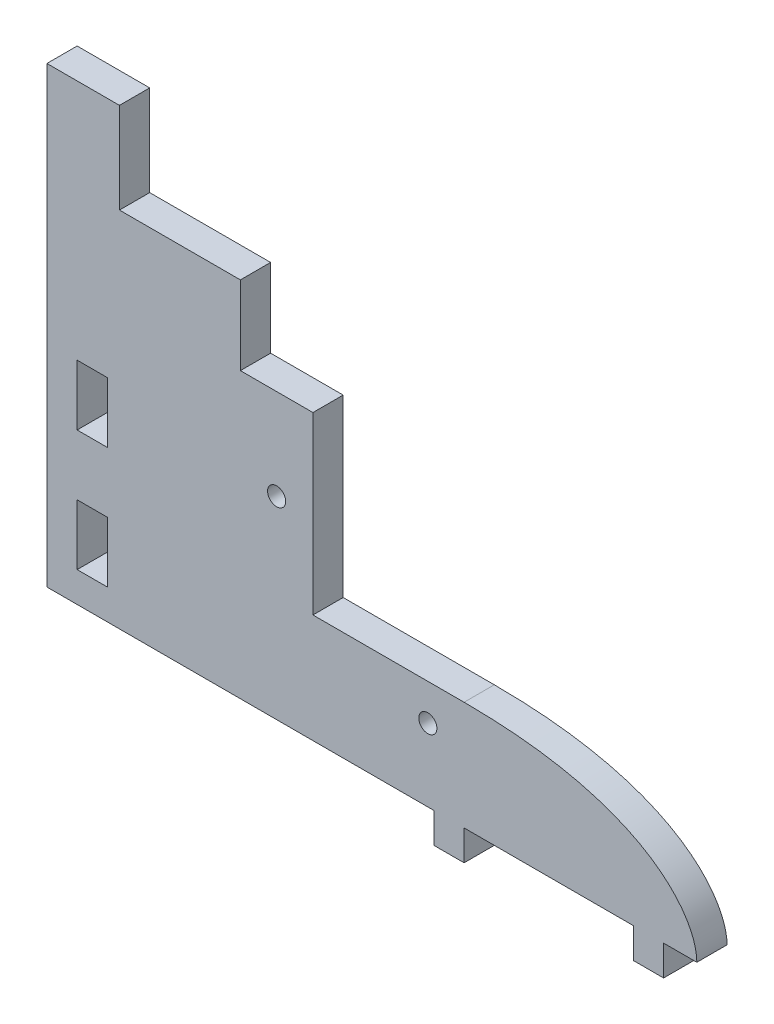
ISO-10303-21;
HEADER;
FILE_DESCRIPTION(('STEP AP214'),'2;1');
FILE_NAME('part.step','',(''),(''),'','','');
FILE_SCHEMA(('AUTOMOTIVE_DESIGN { 1 0 10303 214 1 1 1 1 }'));
ENDSEC;
DATA;
#1=APPLICATION_CONTEXT('core data for automotive mechanical design processes');
#2=APPLICATION_PROTOCOL_DEFINITION('international standard','automotive_design',2000,#1);
#3=PRODUCT_CONTEXT('',#1,'mechanical');
#4=PRODUCT('Part','Part','',(#3));
#5=PRODUCT_RELATED_PRODUCT_CATEGORY('part','',(#4));
#6=PRODUCT_DEFINITION_FORMATION('','',#4);
#7=PRODUCT_DEFINITION_CONTEXT('part definition',#1,'design');
#8=PRODUCT_DEFINITION('design','',#6,#7);
#9=PRODUCT_DEFINITION_SHAPE('','',#8);
#10=(LENGTH_UNIT() NAMED_UNIT(*) SI_UNIT(.MILLI.,.METRE.));
#11=(NAMED_UNIT(*) PLANE_ANGLE_UNIT() SI_UNIT($,.RADIAN.));
#12=(NAMED_UNIT(*) SI_UNIT($,.STERADIAN.) SOLID_ANGLE_UNIT());
#13=UNCERTAINTY_MEASURE_WITH_UNIT(LENGTH_MEASURE(1.E-05),#10,'distance_accuracy_value','');
#14=(GEOMETRIC_REPRESENTATION_CONTEXT(3) GLOBAL_UNCERTAINTY_ASSIGNED_CONTEXT((#13)) GLOBAL_UNIT_ASSIGNED_CONTEXT((#10,
#11,#12)) REPRESENTATION_CONTEXT('',''));
#15=CARTESIAN_POINT('',(0.,0.,0.));
#16=DIRECTION('',(0.,0.,1.));
#17=DIRECTION('',(1.,0.,0.));
#18=AXIS2_PLACEMENT_3D('',#15,#16,#17);
#19=CARTESIAN_POINT('',(37.,0.,5.));
#20=DIRECTION('',(-1.,0.,0.));
#21=DIRECTION('',(0.,0.,1.));
#22=AXIS2_PLACEMENT_3D('',#19,#20,#21);
#23=PLANE('',#22);
#24=DIRECTION('',(0.,0.,-1.));
#25=VECTOR('',#24,1.);
#26=CARTESIAN_POINT('',(37.,0.,5.));
#27=LINE('',#26,#25);
#28=CARTESIAN_POINT('',(37.,0.,5.));
#29=VERTEX_POINT('',#28);
#30=CARTESIAN_POINT('',(37.,0.,0.));
#31=VERTEX_POINT('',#30);
#32=EDGE_CURVE('E176',#29,#31,#27,.T.);
#33=ORIENTED_EDGE('',*,*,#32,.F.);
#34=DIRECTION('',(0.,1.,0.));
#35=VECTOR('',#34,1.);
#36=CARTESIAN_POINT('',(37.,0.,5.));
#37=LINE('',#36,#35);
#38=CARTESIAN_POINT('',(37.,-5.,5.));
#39=VERTEX_POINT('',#38);
#40=EDGE_CURVE('E114',#39,#29,#37,.T.);
#41=ORIENTED_EDGE('',*,*,#40,.F.);
#42=DIRECTION('',(0.,0.,-1.));
#43=VECTOR('',#42,1.);
#44=CARTESIAN_POINT('',(37.,-5.,5.));
#45=LINE('',#44,#43);
#46=CARTESIAN_POINT('',(37.,-5.,0.));
#47=VERTEX_POINT('',#46);
#48=EDGE_CURVE('E174',#39,#47,#45,.T.);
#49=ORIENTED_EDGE('',*,*,#48,.T.);
#50=DIRECTION('',(0.,1.,0.));
#51=VECTOR('',#50,1.);
#52=CARTESIAN_POINT('',(37.,0.,0.));
#53=LINE('',#52,#51);
#54=EDGE_CURVE('E134',#47,#31,#53,.T.);
#55=ORIENTED_EDGE('',*,*,#54,.T.);
#56=EDGE_LOOP('',(#33,#41,#49,#55));
#57=FACE_BOUND('',#56,.T.);
#58=ADVANCED_FACE('F35',(#57),#23,.F.);
#59=CARTESIAN_POINT('',(0.,0.,5.));
#60=DIRECTION('',(0.,0.,-1.));
#61=DIRECTION('',(-1.,0.,0.));
#62=AXIS2_PLACEMENT_3D('',#59,#60,#61);
#63=PLANE('',#62);
#64=CARTESIAN_POINT('',(6.,32.,5.));
#65=DIRECTION('',(0.,0.,1.));
#66=DIRECTION('',(1.,0.,0.));
#67=AXIS2_PLACEMENT_3D('',#64,#65,#66);
#68=CIRCLE('',#67,1.5);
#69=CARTESIAN_POINT('',(7.5,32.,5.));
#70=VERTEX_POINT('',#69);
#71=EDGE_CURVE('E129',#70,#70,#68,.T.);
#72=ORIENTED_EDGE('',*,*,#71,.F.);
#73=EDGE_LOOP('',(#72));
#74=FACE_BOUND('',#73,.T.);
#75=DIRECTION('',(-1.,0.,0.));
#76=VECTOR('',#75,1.);
#77=CARTESIAN_POINT('',(0.,47.,5.));
#78=LINE('',#77,#76);
#79=CARTESIAN_POINT('',(12.,47.,5.));
#80=VERTEX_POINT('',#79);
#81=CARTESIAN_POINT('',(0.,47.,5.));
#82=VERTEX_POINT('',#81);
#83=EDGE_CURVE('E54',#80,#82,#78,.T.);
#84=ORIENTED_EDGE('',*,*,#83,.T.);
#85=DIRECTION('',(0.,1.,0.));
#86=VECTOR('',#85,1.);
#87=CARTESIAN_POINT('',(0.,0.,5.));
#88=LINE('',#87,#86);
#89=CARTESIAN_POINT('',(0.,60.,5.));
#90=VERTEX_POINT('',#89);
#91=EDGE_CURVE('E239',#82,#90,#88,.T.);
#92=ORIENTED_EDGE('',*,*,#91,.T.);
#93=DIRECTION('',(-1.,0.,0.));
#94=VECTOR('',#93,1.);
#95=CARTESIAN_POINT('',(0.,60.,5.));
#96=LINE('',#95,#94);
#97=CARTESIAN_POINT('',(-20.,60.,5.));
#98=VERTEX_POINT('',#97);
#99=EDGE_CURVE('E236',#90,#98,#96,.T.);
#100=ORIENTED_EDGE('',*,*,#99,.T.);
#101=DIRECTION('',(0.,1.,0.));
#102=VECTOR('',#101,1.);
#103=CARTESIAN_POINT('',(-20.,0.,5.));
#104=LINE('',#103,#102);
#105=CARTESIAN_POINT('',(-20.,75.,5.));
#106=VERTEX_POINT('',#105);
#107=EDGE_CURVE('E233',#98,#106,#104,.T.);
#108=ORIENTED_EDGE('',*,*,#107,.T.);
#109=DIRECTION('',(-1.,0.,0.));
#110=VECTOR('',#109,1.);
#111=CARTESIAN_POINT('',(0.,75.,5.));
#112=LINE('',#111,#110);
#113=CARTESIAN_POINT('',(-32.,75.,5.));
#114=VERTEX_POINT('',#113);
#115=EDGE_CURVE('E230',#106,#114,#112,.T.);
#116=ORIENTED_EDGE('',*,*,#115,.T.);
#117=DIRECTION('',(0.,1.,0.));
#118=VECTOR('',#117,1.);
#119=CARTESIAN_POINT('',(-32.,0.,5.));
#120=LINE('',#119,#118);
#121=CARTESIAN_POINT('',(-32.,0.,5.));
#122=VERTEX_POINT('',#121);
#123=EDGE_CURVE('E242',#122,#114,#120,.T.);
#124=ORIENTED_EDGE('',*,*,#123,.F.);
#125=DIRECTION('',(1.,0.,0.));
#126=VECTOR('',#125,1.);
#127=CARTESIAN_POINT('',(0.,0.,5.));
#128=LINE('',#127,#126);
#129=CARTESIAN_POINT('',(32.,0.,5.));
#130=VERTEX_POINT('',#129);
#131=EDGE_CURVE('E93',#122,#130,#128,.T.);
#132=ORIENTED_EDGE('',*,*,#131,.T.);
#133=DIRECTION('',(0.,-1.,0.));
#134=VECTOR('',#133,1.);
#135=CARTESIAN_POINT('',(32.,0.,5.));
#136=LINE('',#135,#134);
#137=CARTESIAN_POINT('',(32.,-5.,5.));
#138=VERTEX_POINT('',#137);
#139=EDGE_CURVE('E151',#130,#138,#136,.T.);
#140=ORIENTED_EDGE('',*,*,#139,.T.);
#141=DIRECTION('',(1.,0.,0.));
#142=VECTOR('',#141,1.);
#143=CARTESIAN_POINT('',(37.,-5.,5.));
#144=LINE('',#143,#142);
#145=EDGE_CURVE('E153',#138,#39,#144,.T.);
#146=ORIENTED_EDGE('',*,*,#145,.T.);
#147=ORIENTED_EDGE('',*,*,#40,.T.);
#148=DIRECTION('',(1.,0.,0.));
#149=VECTOR('',#148,1.);
#150=CARTESIAN_POINT('',(0.,0.,5.));
#151=LINE('',#150,#149);
#152=CARTESIAN_POINT('',(65.,0.,5.));
#153=VERTEX_POINT('',#152);
#154=EDGE_CURVE('E166',#29,#153,#151,.T.);
#155=ORIENTED_EDGE('',*,*,#154,.T.);
#156=DIRECTION('',(0.,-1.,0.));
#157=VECTOR('',#156,1.);
#158=CARTESIAN_POINT('',(65.,0.,5.));
#159=LINE('',#158,#157);
#160=CARTESIAN_POINT('',(65.,-5.00000000000018,5.));
#161=VERTEX_POINT('',#160);
#162=EDGE_CURVE('E336',#153,#161,#159,.T.);
#163=ORIENTED_EDGE('',*,*,#162,.T.);
#164=DIRECTION('',(-1.,0.,0.));
#165=VECTOR('',#164,1.);
#166=CARTESIAN_POINT('',(0.,-5.00000000000019,5.));
#167=LINE('',#166,#165);
#168=CARTESIAN_POINT('',(70.,-5.00000000000018,5.));
#169=VERTEX_POINT('',#168);
#170=EDGE_CURVE('E338',#169,#161,#167,.T.);
#171=ORIENTED_EDGE('',*,*,#170,.F.);
#172=DIRECTION('',(0.,-1.,0.));
#173=VECTOR('',#172,1.);
#174=CARTESIAN_POINT('',(70.,0.,5.));
#175=LINE('',#174,#173);
#176=CARTESIAN_POINT('',(70.,0.,5.));
#177=VERTEX_POINT('',#176);
#178=EDGE_CURVE('E341',#177,#169,#175,.T.);
#179=ORIENTED_EDGE('',*,*,#178,.F.);
#180=DIRECTION('',(1.,0.,0.));
#181=VECTOR('',#180,1.);
#182=CARTESIAN_POINT('',(0.,0.,5.));
#183=LINE('',#182,#181);
#184=CARTESIAN_POINT('',(75.5,0.,5.));
#185=VERTEX_POINT('',#184);
#186=EDGE_CURVE('E314',#177,#185,#183,.T.);
#187=ORIENTED_EDGE('',*,*,#186,.T.);
#188=CARTESIAN_POINT('',(75.5,0.,5.));
#189=CARTESIAN_POINT('',(75.5,5.98223252941199,5.));
#190=CARTESIAN_POINT('',(67.6854096357002,18.,5.));
#191=CARTESIAN_POINT('',(37.,18.,5.));
#192=B_SPLINE_CURVE_WITH_KNOTS('',3,(#188,#189,#190,#191),.UNSPECIFIED.,.F.,.F.,(4,4),(0.,1.),.UNSPECIFIED.);
#193=CARTESIAN_POINT('',(37.,18.,5.));
#194=VERTEX_POINT('',#193);
#195=EDGE_CURVE('E112',#185,#194,#192,.T.);
#196=ORIENTED_EDGE('',*,*,#195,.T.);
#197=DIRECTION('',(-1.,0.,0.));
#198=VECTOR('',#197,1.);
#199=CARTESIAN_POINT('',(12.,18.,5.));
#200=LINE('',#199,#198);
#201=CARTESIAN_POINT('',(12.,18.,5.));
#202=VERTEX_POINT('',#201);
#203=EDGE_CURVE('E104',#194,#202,#200,.T.);
#204=ORIENTED_EDGE('',*,*,#203,.T.);
#205=DIRECTION('',(0.,1.,0.));
#206=VECTOR('',#205,1.);
#207=CARTESIAN_POINT('',(12.,47.,5.));
#208=LINE('',#207,#206);
#209=EDGE_CURVE('E108',#202,#80,#208,.T.);
#210=ORIENTED_EDGE('',*,*,#209,.T.);
#211=EDGE_LOOP('',(#84,#92,#100,#108,#116,#124,#132,#140,#146,#147,#155,#163,#171,#179,#187,
#196,#204,#210));
#212=FACE_BOUND('',#211,.T.);
#213=CARTESIAN_POINT('',(31.,12.,5.));
#214=DIRECTION('',(0.,0.,1.));
#215=DIRECTION('',(1.,0.,0.));
#216=AXIS2_PLACEMENT_3D('',#213,#214,#215);
#217=CIRCLE('',#216,1.5);
#218=CARTESIAN_POINT('',(32.5,12.,5.));
#219=VERTEX_POINT('',#218);
#220=EDGE_CURVE('E249',#219,#219,#217,.T.);
#221=ORIENTED_EDGE('',*,*,#220,.F.);
#222=EDGE_LOOP('',(#221));
#223=FACE_BOUND('',#222,.T.);
#224=DIRECTION('',(0.,-1.,0.));
#225=VECTOR('',#224,1.);
#226=CARTESIAN_POINT('',(-22.,0.,5.));
#227=LINE('',#226,#225);
#228=CARTESIAN_POINT('',(-22.,35.,5.));
#229=VERTEX_POINT('',#228);
#230=CARTESIAN_POINT('',(-22.,25.,5.));
#231=VERTEX_POINT('',#230);
#232=EDGE_CURVE('E205',#229,#231,#227,.T.);
#233=ORIENTED_EDGE('',*,*,#232,.T.);
#234=DIRECTION('',(1.,0.,0.));
#235=VECTOR('',#234,1.);
#236=CARTESIAN_POINT('',(0.,25.,5.));
#237=LINE('',#236,#235);
#238=CARTESIAN_POINT('',(-27.,25.,5.));
#239=VERTEX_POINT('',#238);
#240=EDGE_CURVE('E215',#239,#231,#237,.T.);
#241=ORIENTED_EDGE('',*,*,#240,.F.);
#242=DIRECTION('',(0.,-1.,0.));
#243=VECTOR('',#242,1.);
#244=CARTESIAN_POINT('',(-27.,0.,5.));
#245=LINE('',#244,#243);
#246=CARTESIAN_POINT('',(-27.,35.,5.));
#247=VERTEX_POINT('',#246);
#248=EDGE_CURVE('E212',#247,#239,#245,.T.);
#249=ORIENTED_EDGE('',*,*,#248,.F.);
#250=DIRECTION('',(1.,0.,0.));
#251=VECTOR('',#250,1.);
#252=CARTESIAN_POINT('',(0.,35.,5.));
#253=LINE('',#252,#251);
#254=EDGE_CURVE('E208',#247,#229,#253,.T.);
#255=ORIENTED_EDGE('',*,*,#254,.T.);
#256=EDGE_LOOP('',(#233,#241,#249,#255));
#257=FACE_BOUND('',#256,.T.);
#258=DIRECTION('',(0.,-1.,0.));
#259=VECTOR('',#258,1.);
#260=CARTESIAN_POINT('',(-22.,0.,5.));
#261=LINE('',#260,#259);
#262=CARTESIAN_POINT('',(-22.,15.,5.));
#263=VERTEX_POINT('',#262);
#264=CARTESIAN_POINT('',(-22.,5.,5.));
#265=VERTEX_POINT('',#264);
#266=EDGE_CURVE('E218',#263,#265,#261,.T.);
#267=ORIENTED_EDGE('',*,*,#266,.T.);
#268=DIRECTION('',(1.,0.,0.));
#269=VECTOR('',#268,1.);
#270=CARTESIAN_POINT('',(0.,5.,5.));
#271=LINE('',#270,#269);
#272=CARTESIAN_POINT('',(-27.,5.,5.));
#273=VERTEX_POINT('',#272);
#274=EDGE_CURVE('E227',#273,#265,#271,.T.);
#275=ORIENTED_EDGE('',*,*,#274,.F.);
#276=DIRECTION('',(0.,-1.,0.));
#277=VECTOR('',#276,1.);
#278=CARTESIAN_POINT('',(-27.,0.,5.));
#279=LINE('',#278,#277);
#280=CARTESIAN_POINT('',(-27.,15.,5.));
#281=VERTEX_POINT('',#280);
#282=EDGE_CURVE('E224',#281,#273,#279,.T.);
#283=ORIENTED_EDGE('',*,*,#282,.F.);
#284=DIRECTION('',(1.,0.,0.));
#285=VECTOR('',#284,1.);
#286=CARTESIAN_POINT('',(0.,15.,5.));
#287=LINE('',#286,#285);
#288=EDGE_CURVE('E221',#281,#263,#287,.T.);
#289=ORIENTED_EDGE('',*,*,#288,.T.);
#290=EDGE_LOOP('',(#267,#275,#283,#289));
#291=FACE_BOUND('',#290,.T.);
#292=ADVANCED_FACE('F105',(#74,#212,#223,#257,#291),#63,.F.);
#293=CARTESIAN_POINT('',(0.,0.,0.));
#294=DIRECTION('',(0.,0.,-1.));
#295=DIRECTION('',(-1.,0.,0.));
#296=AXIS2_PLACEMENT_3D('',#293,#294,#295);
#297=PLANE('',#296);
#298=CARTESIAN_POINT('',(6.,32.,0.));
#299=DIRECTION('',(0.,0.,1.));
#300=DIRECTION('',(1.,0.,0.));
#301=AXIS2_PLACEMENT_3D('',#298,#299,#300);
#302=CIRCLE('',#301,1.5);
#303=CARTESIAN_POINT('',(7.5,32.,0.));
#304=VERTEX_POINT('',#303);
#305=EDGE_CURVE('E156',#304,#304,#302,.T.);
#306=ORIENTED_EDGE('',*,*,#305,.T.);
#307=EDGE_LOOP('',(#306));
#308=FACE_BOUND('',#307,.T.);
#309=DIRECTION('',(1.,0.,0.));
#310=VECTOR('',#309,1.);
#311=CARTESIAN_POINT('',(0.,0.,0.));
#312=LINE('',#311,#310);
#313=CARTESIAN_POINT('',(-32.,0.,0.));
#314=VERTEX_POINT('',#313);
#315=CARTESIAN_POINT('',(32.,0.,0.));
#316=VERTEX_POINT('',#315);
#317=EDGE_CURVE('E126',#314,#316,#312,.T.);
#318=ORIENTED_EDGE('',*,*,#317,.F.);
#319=DIRECTION('',(0.,1.,0.));
#320=VECTOR('',#319,1.);
#321=CARTESIAN_POINT('',(-32.,0.,0.));
#322=LINE('',#321,#320);
#323=CARTESIAN_POINT('',(-32.,75.,0.));
#324=VERTEX_POINT('',#323);
#325=EDGE_CURVE('E209',#314,#324,#322,.T.);
#326=ORIENTED_EDGE('',*,*,#325,.T.);
#327=DIRECTION('',(-1.,0.,0.));
#328=VECTOR('',#327,1.);
#329=CARTESIAN_POINT('',(0.,75.,0.));
#330=LINE('',#329,#328);
#331=CARTESIAN_POINT('',(-20.,75.,0.));
#332=VERTEX_POINT('',#331);
#333=EDGE_CURVE('E451',#332,#324,#330,.T.);
#334=ORIENTED_EDGE('',*,*,#333,.F.);
#335=DIRECTION('',(0.,1.,0.));
#336=VECTOR('',#335,1.);
#337=CARTESIAN_POINT('',(-20.,0.,0.));
#338=LINE('',#337,#336);
#339=CARTESIAN_POINT('',(-20.,60.,0.));
#340=VERTEX_POINT('',#339);
#341=EDGE_CURVE('E454',#340,#332,#338,.T.);
#342=ORIENTED_EDGE('',*,*,#341,.F.);
#343=DIRECTION('',(-1.,0.,0.));
#344=VECTOR('',#343,1.);
#345=CARTESIAN_POINT('',(0.,60.,0.));
#346=LINE('',#345,#344);
#347=CARTESIAN_POINT('',(0.,60.,0.));
#348=VERTEX_POINT('',#347);
#349=EDGE_CURVE('E457',#348,#340,#346,.T.);
#350=ORIENTED_EDGE('',*,*,#349,.F.);
#351=DIRECTION('',(0.,1.,0.));
#352=VECTOR('',#351,1.);
#353=CARTESIAN_POINT('',(0.,0.,0.));
#354=LINE('',#353,#352);
#355=CARTESIAN_POINT('',(0.,47.,0.));
#356=VERTEX_POINT('',#355);
#357=EDGE_CURVE('E246',#356,#348,#354,.T.);
#358=ORIENTED_EDGE('',*,*,#357,.F.);
#359=DIRECTION('',(-1.,0.,0.));
#360=VECTOR('',#359,1.);
#361=CARTESIAN_POINT('',(0.,47.,0.));
#362=LINE('',#361,#360);
#363=CARTESIAN_POINT('',(12.,47.,0.));
#364=VERTEX_POINT('',#363);
#365=EDGE_CURVE('E139',#364,#356,#362,.T.);
#366=ORIENTED_EDGE('',*,*,#365,.F.);
#367=DIRECTION('',(0.,1.,0.));
#368=VECTOR('',#367,1.);
#369=CARTESIAN_POINT('',(12.,47.,0.));
#370=LINE('',#369,#368);
#371=CARTESIAN_POINT('',(12.,18.,0.));
#372=VERTEX_POINT('',#371);
#373=EDGE_CURVE('E85',#372,#364,#370,.T.);
#374=ORIENTED_EDGE('',*,*,#373,.F.);
#375=DIRECTION('',(-1.,0.,0.));
#376=VECTOR('',#375,1.);
#377=CARTESIAN_POINT('',(12.,18.,0.));
#378=LINE('',#377,#376);
#379=CARTESIAN_POINT('',(37.,18.,0.));
#380=VERTEX_POINT('',#379);
#381=EDGE_CURVE('E78',#380,#372,#378,.T.);
#382=ORIENTED_EDGE('',*,*,#381,.F.);
#383=CARTESIAN_POINT('',(75.5,0.,0.));
#384=CARTESIAN_POINT('',(75.5,5.98223252941199,0.));
#385=CARTESIAN_POINT('',(67.6854096357002,18.,0.));
#386=CARTESIAN_POINT('',(37.,18.,0.));
#387=B_SPLINE_CURVE_WITH_KNOTS('',3,(#383,#384,#385,#386),.UNSPECIFIED.,.F.,.F.,(4,4),(0.,1.),.UNSPECIFIED.);
#388=CARTESIAN_POINT('',(75.5,0.,0.));
#389=VERTEX_POINT('',#388);
#390=EDGE_CURVE('E328',#389,#380,#387,.T.);
#391=ORIENTED_EDGE('',*,*,#390,.F.);
#392=DIRECTION('',(1.,0.,0.));
#393=VECTOR('',#392,1.);
#394=CARTESIAN_POINT('',(0.,0.,0.));
#395=LINE('',#394,#393);
#396=CARTESIAN_POINT('',(70.,0.,0.));
#397=VERTEX_POINT('',#396);
#398=EDGE_CURVE('E325',#397,#389,#395,.T.);
#399=ORIENTED_EDGE('',*,*,#398,.F.);
#400=DIRECTION('',(0.,-1.,0.));
#401=VECTOR('',#400,1.);
#402=CARTESIAN_POINT('',(70.,0.,0.));
#403=LINE('',#402,#401);
#404=CARTESIAN_POINT('',(70.,-5.00000000000018,0.));
#405=VERTEX_POINT('',#404);
#406=EDGE_CURVE('E320',#397,#405,#403,.T.);
#407=ORIENTED_EDGE('',*,*,#406,.T.);
#408=DIRECTION('',(-1.,0.,0.));
#409=VECTOR('',#408,1.);
#410=CARTESIAN_POINT('',(0.,-5.00000000000019,0.));
#411=LINE('',#410,#409);
#412=CARTESIAN_POINT('',(65.,-5.00000000000018,0.));
#413=VERTEX_POINT('',#412);
#414=EDGE_CURVE('E316',#405,#413,#411,.T.);
#415=ORIENTED_EDGE('',*,*,#414,.T.);
#416=DIRECTION('',(0.,-1.,0.));
#417=VECTOR('',#416,1.);
#418=CARTESIAN_POINT('',(65.,0.,0.));
#419=LINE('',#418,#417);
#420=CARTESIAN_POINT('',(65.,0.,0.));
#421=VERTEX_POINT('',#420);
#422=EDGE_CURVE('E311',#421,#413,#419,.T.);
#423=ORIENTED_EDGE('',*,*,#422,.F.);
#424=DIRECTION('',(1.,0.,0.));
#425=VECTOR('',#424,1.);
#426=CARTESIAN_POINT('',(0.,0.,0.));
#427=LINE('',#426,#425);
#428=EDGE_CURVE('E191',#31,#421,#427,.T.);
#429=ORIENTED_EDGE('',*,*,#428,.F.);
#430=ORIENTED_EDGE('',*,*,#54,.F.);
#431=DIRECTION('',(1.,0.,0.));
#432=VECTOR('',#431,1.);
#433=CARTESIAN_POINT('',(37.,-5.,0.));
#434=LINE('',#433,#432);
#435=CARTESIAN_POINT('',(32.,-5.,0.));
#436=VERTEX_POINT('',#435);
#437=EDGE_CURVE('E131',#436,#47,#434,.T.);
#438=ORIENTED_EDGE('',*,*,#437,.F.);
#439=DIRECTION('',(0.,-1.,0.));
#440=VECTOR('',#439,1.);
#441=CARTESIAN_POINT('',(32.,0.,0.));
#442=LINE('',#441,#440);
#443=EDGE_CURVE('E128',#316,#436,#442,.T.);
#444=ORIENTED_EDGE('',*,*,#443,.F.);
#445=EDGE_LOOP('',(#318,#326,#334,#342,#350,#358,#366,#374,#382,#391,#399,#407,#415,#423,#429,
#430,#438,#444));
#446=FACE_BOUND('',#445,.T.);
#447=CARTESIAN_POINT('',(31.,12.,0.));
#448=DIRECTION('',(0.,0.,1.));
#449=DIRECTION('',(1.,0.,0.));
#450=AXIS2_PLACEMENT_3D('',#447,#448,#449);
#451=CIRCLE('',#450,1.5);
#452=CARTESIAN_POINT('',(32.5,12.,0.));
#453=VERTEX_POINT('',#452);
#454=EDGE_CURVE('E252',#453,#453,#451,.T.);
#455=ORIENTED_EDGE('',*,*,#454,.T.);
#456=EDGE_LOOP('',(#455));
#457=FACE_BOUND('',#456,.T.);
#458=DIRECTION('',(0.,-1.,0.));
#459=VECTOR('',#458,1.);
#460=CARTESIAN_POINT('',(-22.,0.,0.));
#461=LINE('',#460,#459);
#462=CARTESIAN_POINT('',(-22.,35.,0.));
#463=VERTEX_POINT('',#462);
#464=CARTESIAN_POINT('',(-22.,25.,0.));
#465=VERTEX_POINT('',#464);
#466=EDGE_CURVE('E181',#463,#465,#461,.T.);
#467=ORIENTED_EDGE('',*,*,#466,.F.);
#468=DIRECTION('',(1.,0.,0.));
#469=VECTOR('',#468,1.);
#470=CARTESIAN_POINT('',(0.,35.,0.));
#471=LINE('',#470,#469);
#472=CARTESIAN_POINT('',(-27.,35.,0.));
#473=VERTEX_POINT('',#472);
#474=EDGE_CURVE('E185',#473,#463,#471,.T.);
#475=ORIENTED_EDGE('',*,*,#474,.F.);
#476=DIRECTION('',(0.,-1.,0.));
#477=VECTOR('',#476,1.);
#478=CARTESIAN_POINT('',(-27.,0.,0.));
#479=LINE('',#478,#477);
#480=CARTESIAN_POINT('',(-27.,25.,0.));
#481=VERTEX_POINT('',#480);
#482=EDGE_CURVE('E433',#473,#481,#479,.T.);
#483=ORIENTED_EDGE('',*,*,#482,.T.);
#484=DIRECTION('',(1.,0.,0.));
#485=VECTOR('',#484,1.);
#486=CARTESIAN_POINT('',(0.,25.,0.));
#487=LINE('',#486,#485);
#488=EDGE_CURVE('E430',#481,#465,#487,.T.);
#489=ORIENTED_EDGE('',*,*,#488,.T.);
#490=EDGE_LOOP('',(#467,#475,#483,#489));
#491=FACE_BOUND('',#490,.T.);
#492=DIRECTION('',(0.,-1.,0.));
#493=VECTOR('',#492,1.);
#494=CARTESIAN_POINT('',(-22.,0.,0.));
#495=LINE('',#494,#493);
#496=CARTESIAN_POINT('',(-22.,15.,0.));
#497=VERTEX_POINT('',#496);
#498=CARTESIAN_POINT('',(-22.,5.,0.));
#499=VERTEX_POINT('',#498);
#500=EDGE_CURVE('E435',#497,#499,#495,.T.);
#501=ORIENTED_EDGE('',*,*,#500,.F.);
#502=DIRECTION('',(1.,0.,0.));
#503=VECTOR('',#502,1.);
#504=CARTESIAN_POINT('',(0.,15.,0.));
#505=LINE('',#504,#503);
#506=CARTESIAN_POINT('',(-27.,15.,0.));
#507=VERTEX_POINT('',#506);
#508=EDGE_CURVE('E438',#507,#497,#505,.T.);
#509=ORIENTED_EDGE('',*,*,#508,.F.);
#510=DIRECTION('',(0.,-1.,0.));
#511=VECTOR('',#510,1.);
#512=CARTESIAN_POINT('',(-27.,0.,0.));
#513=LINE('',#512,#511);
#514=CARTESIAN_POINT('',(-27.,5.,0.));
#515=VERTEX_POINT('',#514);
#516=EDGE_CURVE('E445',#507,#515,#513,.T.);
#517=ORIENTED_EDGE('',*,*,#516,.T.);
#518=DIRECTION('',(1.,0.,0.));
#519=VECTOR('',#518,1.);
#520=CARTESIAN_POINT('',(0.,5.,0.));
#521=LINE('',#520,#519);
#522=EDGE_CURVE('E448',#515,#499,#521,.T.);
#523=ORIENTED_EDGE('',*,*,#522,.T.);
#524=EDGE_LOOP('',(#501,#509,#517,#523));
#525=FACE_BOUND('',#524,.T.);
#526=ADVANCED_FACE('F261',(#308,#446,#457,#491,#525),#297,.T.);
#527=CARTESIAN_POINT('',(0.,0.,5.));
#528=DIRECTION('',(0.,1.,0.));
#529=DIRECTION('',(-1.,0.,0.));
#530=AXIS2_PLACEMENT_3D('',#527,#528,#529);
#531=PLANE('',#530);
#532=ORIENTED_EDGE('',*,*,#317,.T.);
#533=DIRECTION('',(0.,0.,-1.));
#534=VECTOR('',#533,1.);
#535=CARTESIAN_POINT('',(32.,0.,5.));
#536=LINE('',#535,#534);
#537=EDGE_CURVE('E11',#130,#316,#536,.T.);
#538=ORIENTED_EDGE('',*,*,#537,.F.);
#539=ORIENTED_EDGE('',*,*,#131,.F.);
#540=DIRECTION('',(0.,0.,-1.));
#541=VECTOR('',#540,1.);
#542=CARTESIAN_POINT('',(-32.,0.,5.));
#543=LINE('',#542,#541);
#544=EDGE_CURVE('E465',#122,#314,#543,.T.);
#545=ORIENTED_EDGE('',*,*,#544,.T.);
#546=EDGE_LOOP('',(#532,#538,#539,#545));
#547=FACE_BOUND('',#546,.T.);
#548=ADVANCED_FACE('F37',(#547),#531,.F.);
#549=CARTESIAN_POINT('',(32.,0.,5.));
#550=DIRECTION('',(1.,0.,0.));
#551=DIRECTION('',(0.,0.,-1.));
#552=AXIS2_PLACEMENT_3D('',#549,#550,#551);
#553=PLANE('',#552);
#554=ORIENTED_EDGE('',*,*,#443,.T.);
#555=DIRECTION('',(0.,0.,-1.));
#556=VECTOR('',#555,1.);
#557=CARTESIAN_POINT('',(32.,-5.,5.));
#558=LINE('',#557,#556);
#559=EDGE_CURVE('E45',#138,#436,#558,.T.);
#560=ORIENTED_EDGE('',*,*,#559,.F.);
#561=ORIENTED_EDGE('',*,*,#139,.F.);
#562=ORIENTED_EDGE('',*,*,#537,.T.);
#563=EDGE_LOOP('',(#554,#560,#561,#562));
#564=FACE_BOUND('',#563,.T.);
#565=ADVANCED_FACE('F292',(#564),#553,.F.);
#566=CARTESIAN_POINT('',(37.,-5.,5.));
#567=DIRECTION('',(0.,1.,0.));
#568=DIRECTION('',(-1.,0.,0.));
#569=AXIS2_PLACEMENT_3D('',#566,#567,#568);
#570=PLANE('',#569);
#571=ORIENTED_EDGE('',*,*,#437,.T.);
#572=ORIENTED_EDGE('',*,*,#48,.F.);
#573=ORIENTED_EDGE('',*,*,#145,.F.);
#574=ORIENTED_EDGE('',*,*,#559,.T.);
#575=EDGE_LOOP('',(#571,#572,#573,#574));
#576=FACE_BOUND('',#575,.T.);
#577=ADVANCED_FACE('F290',(#576),#570,.F.);
#578=CARTESIAN_POINT('',(12.,18.,5.));
#579=DIRECTION('',(0.,-1.,0.));
#580=DIRECTION('',(0.,0.,-1.));
#581=AXIS2_PLACEMENT_3D('',#578,#579,#580);
#582=PLANE('',#581);
#583=ORIENTED_EDGE('',*,*,#381,.T.);
#584=DIRECTION('',(0.,0.,-1.));
#585=VECTOR('',#584,1.);
#586=CARTESIAN_POINT('',(12.,18.,5.));
#587=LINE('',#586,#585);
#588=EDGE_CURVE('E116',#202,#372,#587,.T.);
#589=ORIENTED_EDGE('',*,*,#588,.F.);
#590=ORIENTED_EDGE('',*,*,#203,.F.);
#591=DIRECTION('',(0.,0.,-1.));
#592=VECTOR('',#591,1.);
#593=CARTESIAN_POINT('',(37.,18.,5.));
#594=LINE('',#593,#592);
#595=EDGE_CURVE('E118',#194,#380,#594,.T.);
#596=ORIENTED_EDGE('',*,*,#595,.T.);
#597=EDGE_LOOP('',(#583,#589,#590,#596));
#598=FACE_BOUND('',#597,.T.);
#599=ADVANCED_FACE('F117',(#598),#582,.F.);
#600=CARTESIAN_POINT('',(12.,47.,5.));
#601=DIRECTION('',(-1.,0.,0.));
#602=DIRECTION('',(0.,-1.,0.));
#603=AXIS2_PLACEMENT_3D('',#600,#601,#602);
#604=PLANE('',#603);
#605=ORIENTED_EDGE('',*,*,#373,.T.);
#606=DIRECTION('',(0.,0.,-1.));
#607=VECTOR('',#606,1.);
#608=CARTESIAN_POINT('',(12.,47.,5.));
#609=LINE('',#608,#607);
#610=EDGE_CURVE('E119',#80,#364,#609,.T.);
#611=ORIENTED_EDGE('',*,*,#610,.F.);
#612=ORIENTED_EDGE('',*,*,#209,.F.);
#613=ORIENTED_EDGE('',*,*,#588,.T.);
#614=EDGE_LOOP('',(#605,#611,#612,#613));
#615=FACE_BOUND('',#614,.T.);
#616=ADVANCED_FACE('F121',(#615),#604,.F.);
#617=CARTESIAN_POINT('',(0.,47.,5.));
#618=DIRECTION('',(0.,-1.,0.));
#619=DIRECTION('',(0.,0.,-1.));
#620=AXIS2_PLACEMENT_3D('',#617,#618,#619);
#621=PLANE('',#620);
#622=ORIENTED_EDGE('',*,*,#365,.T.);
#623=DIRECTION('',(0.,0.,-1.));
#624=VECTOR('',#623,1.);
#625=CARTESIAN_POINT('',(0.,47.,5.));
#626=LINE('',#625,#624);
#627=EDGE_CURVE('E123',#82,#356,#626,.T.);
#628=ORIENTED_EDGE('',*,*,#627,.F.);
#629=ORIENTED_EDGE('',*,*,#83,.F.);
#630=ORIENTED_EDGE('',*,*,#610,.T.);
#631=EDGE_LOOP('',(#622,#628,#629,#630));
#632=FACE_BOUND('',#631,.T.);
#633=ADVANCED_FACE('F267',(#632),#621,.F.);
#634=CARTESIAN_POINT('',(6.,32.,5.));
#635=DIRECTION('',(0.,0.,-1.));
#636=DIRECTION('',(-1.,0.,0.));
#637=AXIS2_PLACEMENT_3D('',#634,#635,#636);
#638=CYLINDRICAL_SURFACE('',#637,1.5);
#639=ORIENTED_EDGE('',*,*,#71,.T.);
#640=EDGE_LOOP('',(#639));
#641=FACE_BOUND('',#640,.T.);
#642=ORIENTED_EDGE('',*,*,#305,.F.);
#643=EDGE_LOOP('',(#642));
#644=FACE_BOUND('',#643,.T.);
#645=ADVANCED_FACE('F264',(#641,#644),#638,.F.);
#646=CARTESIAN_POINT('',(31.,12.,5.));
#647=DIRECTION('',(0.,0.,-1.));
#648=DIRECTION('',(-1.,0.,0.));
#649=AXIS2_PLACEMENT_3D('',#646,#647,#648);
#650=CYLINDRICAL_SURFACE('',#649,1.5);
#651=ORIENTED_EDGE('',*,*,#220,.T.);
#652=EDGE_LOOP('',(#651));
#653=FACE_BOUND('',#652,.T.);
#654=ORIENTED_EDGE('',*,*,#454,.F.);
#655=EDGE_LOOP('',(#654));
#656=FACE_BOUND('',#655,.T.);
#657=ADVANCED_FACE('F266',(#653,#656),#650,.F.);
#658=CARTESIAN_POINT('',(0.,0.,5.));
#659=DIRECTION('',(-1.,0.,0.));
#660=DIRECTION('',(0.,-1.,0.));
#661=AXIS2_PLACEMENT_3D('',#658,#659,#660);
#662=PLANE('',#661);
#663=ORIENTED_EDGE('',*,*,#91,.F.);
#664=ORIENTED_EDGE('',*,*,#627,.T.);
#665=ORIENTED_EDGE('',*,*,#357,.T.);
#666=DIRECTION('',(0.,0.,-1.));
#667=VECTOR('',#666,1.);
#668=CARTESIAN_POINT('',(0.,60.,5.));
#669=LINE('',#668,#667);
#670=EDGE_CURVE('E468',#90,#348,#669,.T.);
#671=ORIENTED_EDGE('',*,*,#670,.F.);
#672=EDGE_LOOP('',(#663,#664,#665,#671));
#673=FACE_BOUND('',#672,.T.);
#674=ADVANCED_FACE('F273',(#673),#662,.F.);
#675=CARTESIAN_POINT('',(0.,75.,5.));
#676=DIRECTION('',(0.,-1.,0.));
#677=DIRECTION('',(0.,0.,-1.));
#678=AXIS2_PLACEMENT_3D('',#675,#676,#677);
#679=PLANE('',#678);
#680=ORIENTED_EDGE('',*,*,#333,.T.);
#681=DIRECTION('',(0.,0.,-1.));
#682=VECTOR('',#681,1.);
#683=CARTESIAN_POINT('',(-32.,75.,5.));
#684=LINE('',#683,#682);
#685=EDGE_CURVE('E254',#114,#324,#684,.T.);
#686=ORIENTED_EDGE('',*,*,#685,.F.);
#687=ORIENTED_EDGE('',*,*,#115,.F.);
#688=DIRECTION('',(0.,0.,-1.));
#689=VECTOR('',#688,1.);
#690=CARTESIAN_POINT('',(-20.,75.,5.));
#691=LINE('',#690,#689);
#692=EDGE_CURVE('E474',#106,#332,#691,.T.);
#693=ORIENTED_EDGE('',*,*,#692,.T.);
#694=EDGE_LOOP('',(#680,#686,#687,#693));
#695=FACE_BOUND('',#694,.T.);
#696=ADVANCED_FACE('F364',(#695),#679,.F.);
#697=CARTESIAN_POINT('',(-32.,0.,5.));
#698=DIRECTION('',(-1.,0.,0.));
#699=DIRECTION('',(0.,0.,1.));
#700=AXIS2_PLACEMENT_3D('',#697,#698,#699);
#701=PLANE('',#700);
#702=ORIENTED_EDGE('',*,*,#325,.F.);
#703=ORIENTED_EDGE('',*,*,#544,.F.);
#704=ORIENTED_EDGE('',*,*,#123,.T.);
#705=ORIENTED_EDGE('',*,*,#685,.T.);
#706=EDGE_LOOP('',(#702,#703,#704,#705));
#707=FACE_BOUND('',#706,.T.);
#708=ADVANCED_FACE('F360',(#707),#701,.T.);
#709=CARTESIAN_POINT('',(0.,60.,5.));
#710=DIRECTION('',(0.,-1.,0.));
#711=DIRECTION('',(0.,0.,-1.));
#712=AXIS2_PLACEMENT_3D('',#709,#710,#711);
#713=PLANE('',#712);
#714=ORIENTED_EDGE('',*,*,#349,.T.);
#715=DIRECTION('',(0.,0.,-1.));
#716=VECTOR('',#715,1.);
#717=CARTESIAN_POINT('',(-20.,60.,5.));
#718=LINE('',#717,#716);
#719=EDGE_CURVE('E471',#98,#340,#718,.T.);
#720=ORIENTED_EDGE('',*,*,#719,.F.);
#721=ORIENTED_EDGE('',*,*,#99,.F.);
#722=ORIENTED_EDGE('',*,*,#670,.T.);
#723=EDGE_LOOP('',(#714,#720,#721,#722));
#724=FACE_BOUND('',#723,.T.);
#725=ADVANCED_FACE('F363',(#724),#713,.F.);
#726=CARTESIAN_POINT('',(-22.,0.,5.));
#727=DIRECTION('',(1.,0.,0.));
#728=DIRECTION('',(0.,0.,-1.));
#729=AXIS2_PLACEMENT_3D('',#726,#727,#728);
#730=PLANE('',#729);
#731=ORIENTED_EDGE('',*,*,#500,.T.);
#732=DIRECTION('',(0.,0.,-1.));
#733=VECTOR('',#732,1.);
#734=CARTESIAN_POINT('',(-22.,5.,5.));
#735=LINE('',#734,#733);
#736=EDGE_CURVE('E477',#265,#499,#735,.T.);
#737=ORIENTED_EDGE('',*,*,#736,.F.);
#738=ORIENTED_EDGE('',*,*,#266,.F.);
#739=DIRECTION('',(0.,0.,-1.));
#740=VECTOR('',#739,1.);
#741=CARTESIAN_POINT('',(-22.,15.,5.));
#742=LINE('',#741,#740);
#743=EDGE_CURVE('E486',#263,#497,#742,.T.);
#744=ORIENTED_EDGE('',*,*,#743,.T.);
#745=EDGE_LOOP('',(#731,#737,#738,#744));
#746=FACE_BOUND('',#745,.T.);
#747=ADVANCED_FACE('F371',(#746),#730,.F.);
#748=CARTESIAN_POINT('',(0.,5.,5.));
#749=DIRECTION('',(0.,1.,0.));
#750=DIRECTION('',(-1.,0.,0.));
#751=AXIS2_PLACEMENT_3D('',#748,#749,#750);
#752=PLANE('',#751);
#753=ORIENTED_EDGE('',*,*,#522,.F.);
#754=DIRECTION('',(0.,0.,-1.));
#755=VECTOR('',#754,1.);
#756=CARTESIAN_POINT('',(-27.,5.,5.));
#757=LINE('',#756,#755);
#758=EDGE_CURVE('E480',#273,#515,#757,.T.);
#759=ORIENTED_EDGE('',*,*,#758,.F.);
#760=ORIENTED_EDGE('',*,*,#274,.T.);
#761=ORIENTED_EDGE('',*,*,#736,.T.);
#762=EDGE_LOOP('',(#753,#759,#760,#761));
#763=FACE_BOUND('',#762,.T.);
#764=ADVANCED_FACE('F380',(#763),#752,.T.);
#765=CARTESIAN_POINT('',(-27.,0.,5.));
#766=DIRECTION('',(1.,0.,0.));
#767=DIRECTION('',(0.,0.,-1.));
#768=AXIS2_PLACEMENT_3D('',#765,#766,#767);
#769=PLANE('',#768);
#770=ORIENTED_EDGE('',*,*,#516,.F.);
#771=DIRECTION('',(0.,0.,-1.));
#772=VECTOR('',#771,1.);
#773=CARTESIAN_POINT('',(-27.,15.,5.));
#774=LINE('',#773,#772);
#775=EDGE_CURVE('E483',#281,#507,#774,.T.);
#776=ORIENTED_EDGE('',*,*,#775,.F.);
#777=ORIENTED_EDGE('',*,*,#282,.T.);
#778=ORIENTED_EDGE('',*,*,#758,.T.);
#779=EDGE_LOOP('',(#770,#776,#777,#778));
#780=FACE_BOUND('',#779,.T.);
#781=ADVANCED_FACE('F383',(#780),#769,.T.);
#782=CARTESIAN_POINT('',(-22.,0.,5.));
#783=DIRECTION('',(1.,0.,0.));
#784=DIRECTION('',(0.,0.,-1.));
#785=AXIS2_PLACEMENT_3D('',#782,#783,#784);
#786=PLANE('',#785);
#787=ORIENTED_EDGE('',*,*,#466,.T.);
#788=DIRECTION('',(0.,0.,-1.));
#789=VECTOR('',#788,1.);
#790=CARTESIAN_POINT('',(-22.,25.,5.));
#791=LINE('',#790,#789);
#792=EDGE_CURVE('E419',#231,#465,#791,.T.);
#793=ORIENTED_EDGE('',*,*,#792,.F.);
#794=ORIENTED_EDGE('',*,*,#232,.F.);
#795=DIRECTION('',(0.,0.,-1.));
#796=VECTOR('',#795,1.);
#797=CARTESIAN_POINT('',(-22.,35.,5.));
#798=LINE('',#797,#796);
#799=EDGE_CURVE('E422',#229,#463,#798,.T.);
#800=ORIENTED_EDGE('',*,*,#799,.T.);
#801=EDGE_LOOP('',(#787,#793,#794,#800));
#802=FACE_BOUND('',#801,.T.);
#803=ADVANCED_FACE('F387',(#802),#786,.F.);
#804=CARTESIAN_POINT('',(0.,25.,5.));
#805=DIRECTION('',(0.,1.,0.));
#806=DIRECTION('',(0.,0.,1.));
#807=AXIS2_PLACEMENT_3D('',#804,#805,#806);
#808=PLANE('',#807);
#809=ORIENTED_EDGE('',*,*,#488,.F.);
#810=DIRECTION('',(0.,0.,-1.));
#811=VECTOR('',#810,1.);
#812=CARTESIAN_POINT('',(-27.,25.,5.));
#813=LINE('',#812,#811);
#814=EDGE_CURVE('E490',#239,#481,#813,.T.);
#815=ORIENTED_EDGE('',*,*,#814,.F.);
#816=ORIENTED_EDGE('',*,*,#240,.T.);
#817=ORIENTED_EDGE('',*,*,#792,.T.);
#818=EDGE_LOOP('',(#809,#815,#816,#817));
#819=FACE_BOUND('',#818,.T.);
#820=ADVANCED_FACE('F397',(#819),#808,.T.);
#821=CARTESIAN_POINT('',(-27.,0.,5.));
#822=DIRECTION('',(1.,0.,0.));
#823=DIRECTION('',(0.,0.,-1.));
#824=AXIS2_PLACEMENT_3D('',#821,#822,#823);
#825=PLANE('',#824);
#826=ORIENTED_EDGE('',*,*,#482,.F.);
#827=DIRECTION('',(0.,0.,-1.));
#828=VECTOR('',#827,1.);
#829=CARTESIAN_POINT('',(-27.,35.,5.));
#830=LINE('',#829,#828);
#831=EDGE_CURVE('E493',#247,#473,#830,.T.);
#832=ORIENTED_EDGE('',*,*,#831,.F.);
#833=ORIENTED_EDGE('',*,*,#248,.T.);
#834=ORIENTED_EDGE('',*,*,#814,.T.);
#835=EDGE_LOOP('',(#826,#832,#833,#834));
#836=FACE_BOUND('',#835,.T.);
#837=ADVANCED_FACE('F392',(#836),#825,.T.);
#838=CARTESIAN_POINT('',(0.,15.,5.));
#839=DIRECTION('',(0.,1.,0.));
#840=DIRECTION('',(-1.,0.,0.));
#841=AXIS2_PLACEMENT_3D('',#838,#839,#840);
#842=PLANE('',#841);
#843=ORIENTED_EDGE('',*,*,#508,.T.);
#844=ORIENTED_EDGE('',*,*,#743,.F.);
#845=ORIENTED_EDGE('',*,*,#288,.F.);
#846=ORIENTED_EDGE('',*,*,#775,.T.);
#847=EDGE_LOOP('',(#843,#844,#845,#846));
#848=FACE_BOUND('',#847,.T.);
#849=ADVANCED_FACE('F389',(#848),#842,.F.);
#850=CARTESIAN_POINT('',(0.,35.,5.));
#851=DIRECTION('',(0.,1.,0.));
#852=DIRECTION('',(0.,0.,1.));
#853=AXIS2_PLACEMENT_3D('',#850,#851,#852);
#854=PLANE('',#853);
#855=ORIENTED_EDGE('',*,*,#474,.T.);
#856=ORIENTED_EDGE('',*,*,#799,.F.);
#857=ORIENTED_EDGE('',*,*,#254,.F.);
#858=ORIENTED_EDGE('',*,*,#831,.T.);
#859=EDGE_LOOP('',(#855,#856,#857,#858));
#860=FACE_BOUND('',#859,.T.);
#861=ADVANCED_FACE('F375',(#860),#854,.F.);
#862=CARTESIAN_POINT('',(-20.,0.,5.));
#863=DIRECTION('',(-1.,0.,0.));
#864=DIRECTION('',(0.,-1.,0.));
#865=AXIS2_PLACEMENT_3D('',#862,#863,#864);
#866=PLANE('',#865);
#867=ORIENTED_EDGE('',*,*,#341,.T.);
#868=ORIENTED_EDGE('',*,*,#692,.F.);
#869=ORIENTED_EDGE('',*,*,#107,.F.);
#870=ORIENTED_EDGE('',*,*,#719,.T.);
#871=EDGE_LOOP('',(#867,#868,#869,#870));
#872=FACE_BOUND('',#871,.T.);
#873=ADVANCED_FACE('F356',(#872),#866,.F.);
#874=DIRECTION('',(0.,0.,-1.));
#875=VECTOR('',#874,1.);
#876=SURFACE_OF_LINEAR_EXTRUSION('',#192,#875);
#877=ORIENTED_EDGE('',*,*,#390,.T.);
#878=ORIENTED_EDGE('',*,*,#595,.F.);
#879=ORIENTED_EDGE('',*,*,#195,.F.);
#880=DIRECTION('',(0.,0.,-1.));
#881=VECTOR('',#880,1.);
#882=CARTESIAN_POINT('',(75.5,0.,5.));
#883=LINE('',#882,#881);
#884=EDGE_CURVE('E202',#185,#389,#883,.T.);
#885=ORIENTED_EDGE('',*,*,#884,.T.);
#886=EDGE_LOOP('',(#877,#878,#879,#885));
#887=FACE_BOUND('',#886,.T.);
#888=ADVANCED_FACE('F351',(#887),#876,.F.);
#889=CARTESIAN_POINT('',(0.,0.,5.));
#890=DIRECTION('',(0.,1.,0.));
#891=DIRECTION('',(-1.,0.,0.));
#892=AXIS2_PLACEMENT_3D('',#889,#890,#891);
#893=PLANE('',#892);
#894=ORIENTED_EDGE('',*,*,#428,.T.);
#895=DIRECTION('',(0.,0.,-1.));
#896=VECTOR('',#895,1.);
#897=CARTESIAN_POINT('',(65.,0.,5.));
#898=LINE('',#897,#896);
#899=EDGE_CURVE('E182',#153,#421,#898,.T.);
#900=ORIENTED_EDGE('',*,*,#899,.F.);
#901=ORIENTED_EDGE('',*,*,#154,.F.);
#902=ORIENTED_EDGE('',*,*,#32,.T.);
#903=EDGE_LOOP('',(#894,#900,#901,#902));
#904=FACE_BOUND('',#903,.T.);
#905=ADVANCED_FACE('F355',(#904),#893,.F.);
#906=CARTESIAN_POINT('',(65.,0.,5.));
#907=DIRECTION('',(1.,0.,0.));
#908=DIRECTION('',(0.,0.,-1.));
#909=AXIS2_PLACEMENT_3D('',#906,#907,#908);
#910=PLANE('',#909);
#911=ORIENTED_EDGE('',*,*,#422,.T.);
#912=DIRECTION('',(0.,0.,-1.));
#913=VECTOR('',#912,1.);
#914=CARTESIAN_POINT('',(65.,-5.00000000000018,5.));
#915=LINE('',#914,#913);
#916=EDGE_CURVE('E188',#161,#413,#915,.T.);
#917=ORIENTED_EDGE('',*,*,#916,.F.);
#918=ORIENTED_EDGE('',*,*,#162,.F.);
#919=ORIENTED_EDGE('',*,*,#899,.T.);
#920=EDGE_LOOP('',(#911,#917,#918,#919));
#921=FACE_BOUND('',#920,.T.);
#922=ADVANCED_FACE('F596',(#921),#910,.F.);
#923=CARTESIAN_POINT('',(0.,-5.00000000000019,5.));
#924=DIRECTION('',(0.,-1.,0.));
#925=DIRECTION('',(1.,0.,0.));
#926=AXIS2_PLACEMENT_3D('',#923,#924,#925);
#927=PLANE('',#926);
#928=ORIENTED_EDGE('',*,*,#414,.F.);
#929=DIRECTION('',(0.,0.,-1.));
#930=VECTOR('',#929,1.);
#931=CARTESIAN_POINT('',(70.,-5.00000000000018,5.));
#932=LINE('',#931,#930);
#933=EDGE_CURVE('E196',#169,#405,#932,.T.);
#934=ORIENTED_EDGE('',*,*,#933,.F.);
#935=ORIENTED_EDGE('',*,*,#170,.T.);
#936=ORIENTED_EDGE('',*,*,#916,.T.);
#937=EDGE_LOOP('',(#928,#934,#935,#936));
#938=FACE_BOUND('',#937,.T.);
#939=ADVANCED_FACE('F593',(#938),#927,.T.);
#940=CARTESIAN_POINT('',(70.,0.,5.));
#941=DIRECTION('',(1.,0.,0.));
#942=DIRECTION('',(0.,0.,-1.));
#943=AXIS2_PLACEMENT_3D('',#940,#941,#942);
#944=PLANE('',#943);
#945=ORIENTED_EDGE('',*,*,#406,.F.);
#946=DIRECTION('',(0.,0.,-1.));
#947=VECTOR('',#946,1.);
#948=CARTESIAN_POINT('',(70.,0.,5.));
#949=LINE('',#948,#947);
#950=EDGE_CURVE('E199',#177,#397,#949,.T.);
#951=ORIENTED_EDGE('',*,*,#950,.F.);
#952=ORIENTED_EDGE('',*,*,#178,.T.);
#953=ORIENTED_EDGE('',*,*,#933,.T.);
#954=EDGE_LOOP('',(#945,#951,#952,#953));
#955=FACE_BOUND('',#954,.T.);
#956=ADVANCED_FACE('F598',(#955),#944,.T.);
#957=CARTESIAN_POINT('',(0.,0.,5.));
#958=DIRECTION('',(0.,1.,0.));
#959=DIRECTION('',(-1.,0.,0.));
#960=AXIS2_PLACEMENT_3D('',#957,#958,#959);
#961=PLANE('',#960);
#962=ORIENTED_EDGE('',*,*,#398,.T.);
#963=ORIENTED_EDGE('',*,*,#884,.F.);
#964=ORIENTED_EDGE('',*,*,#186,.F.);
#965=ORIENTED_EDGE('',*,*,#950,.T.);
#966=EDGE_LOOP('',(#962,#963,#964,#965));
#967=FACE_BOUND('',#966,.T.);
#968=ADVANCED_FACE('F358',(#967),#961,.F.);
#969=CLOSED_SHELL('',(#58,#292,#526,#548,#565,#577,#599,#616,#633,#645,#657,#674,#696,#708,#725,
#747,#764,#781,#803,#820,#837,#849,#861,#873,#888,#905,#922,#939,#956,#968));
#970=MANIFOLD_SOLID_BREP('B2',#969);
#971=ADVANCED_BREP_SHAPE_REPRESENTATION('',(#18,#970),#14);
#972=SHAPE_DEFINITION_REPRESENTATION(#9,#971);
ENDSEC;
END-ISO-10303-21;
